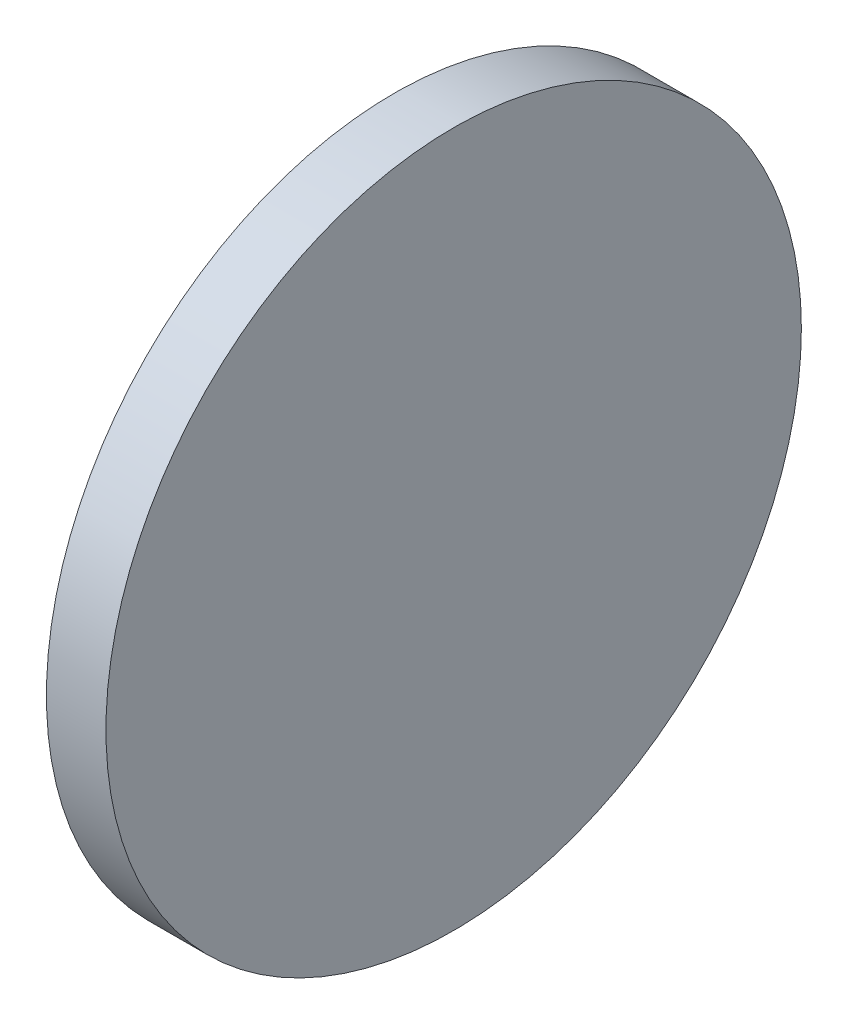
ISO-10303-21;
HEADER;
FILE_DESCRIPTION(('STEP AP214'),'2;1');
FILE_NAME('part.step','',(''),(''),'','','');
FILE_SCHEMA(('AUTOMOTIVE_DESIGN { 1 0 10303 214 1 1 1 1 }'));
ENDSEC;
DATA;
#1=APPLICATION_CONTEXT('core data for automotive mechanical design processes');
#2=APPLICATION_PROTOCOL_DEFINITION('international standard','automotive_design',2000,#1);
#3=PRODUCT_CONTEXT('',#1,'mechanical');
#4=PRODUCT('Part','Part','',(#3));
#5=PRODUCT_RELATED_PRODUCT_CATEGORY('part','',(#4));
#6=PRODUCT_DEFINITION_FORMATION('','',#4);
#7=PRODUCT_DEFINITION_CONTEXT('part definition',#1,'design');
#8=PRODUCT_DEFINITION('design','',#6,#7);
#9=PRODUCT_DEFINITION_SHAPE('','',#8);
#10=(LENGTH_UNIT() NAMED_UNIT(*) SI_UNIT(.MILLI.,.METRE.));
#11=(NAMED_UNIT(*) PLANE_ANGLE_UNIT() SI_UNIT($,.RADIAN.));
#12=(NAMED_UNIT(*) SI_UNIT($,.STERADIAN.) SOLID_ANGLE_UNIT());
#13=UNCERTAINTY_MEASURE_WITH_UNIT(LENGTH_MEASURE(1.E-05),#10,'distance_accuracy_value','');
#14=(GEOMETRIC_REPRESENTATION_CONTEXT(3) GLOBAL_UNCERTAINTY_ASSIGNED_CONTEXT((#13)) GLOBAL_UNIT_ASSIGNED_CONTEXT((#10,
#11,#12)) REPRESENTATION_CONTEXT('',''));
#15=CARTESIAN_POINT('',(0.,0.,0.));
#16=DIRECTION('',(0.,0.,1.));
#17=DIRECTION('',(1.,0.,0.));
#18=AXIS2_PLACEMENT_3D('',#15,#16,#17);
#19=CARTESIAN_POINT('',(-10.029852788347,0.,-1.62196645003831E-13));
#20=DIRECTION('',(0.999999999999989,0.,0.));
#21=DIRECTION('',(0.,0.,-1.));
#22=AXIS2_PLACEMENT_3D('',#19,#20,#21);
#23=PLANE('',#22);
#24=CARTESIAN_POINT('',(-10.029852788347,0.,-1.62196645003831E-13));
#25=DIRECTION('',(0.999999999999989,0.,0.));
#26=DIRECTION('',(0.,0.,-1.));
#27=AXIS2_PLACEMENT_3D('',#24,#25,#26);
#28=CIRCLE('',#27,10.);
#29=CARTESIAN_POINT('',(-10.029852788347,0.,-10.));
#30=VERTEX_POINT('',#29);
#31=EDGE_CURVE('E12',#30,#30,#28,.T.);
#32=ORIENTED_EDGE('',*,*,#31,.T.);
#33=EDGE_LOOP('',(#32));
#34=FACE_BOUND('',#33,.T.);
#35=ADVANCED_FACE('F49',(#34),#23,.T.);
#36=CARTESIAN_POINT('',(0.,0.,0.));
#37=DIRECTION('',(0.999999999999989,0.,0.));
#38=DIRECTION('',(0.,0.,-1.));
#39=AXIS2_PLACEMENT_3D('',#36,#37,#38);
#40=CYLINDRICAL_SURFACE('',#39,10.);
#41=CARTESIAN_POINT('',(-11.7421679655544,0.,0.));
#42=DIRECTION('',(0.999999999999989,0.,0.));
#43=DIRECTION('',(0.,0.,-1.));
#44=AXIS2_PLACEMENT_3D('',#41,#42,#43);
#45=CIRCLE('',#44,10.);
#46=CARTESIAN_POINT('',(-11.7421679655544,0.,-10.));
#47=VERTEX_POINT('',#46);
#48=EDGE_CURVE('E55',#47,#47,#45,.T.);
#49=CARTESIAN_POINT('',(-11.7421679655544,0.,-10.));
#50=CARTESIAN_POINT('',(-11.7243313491252,0.,-10.));
#51=CARTESIAN_POINT('',(-11.7064947326959,0.,-10.));
#52=CARTESIAN_POINT('',(-11.6708214998374,0.,-10.));
#53=CARTESIAN_POINT('',(-11.6529848834082,0.,-10.));
#54=CARTESIAN_POINT('',(-11.6173116505497,0.,-10.));
#55=CARTESIAN_POINT('',(-11.5994750341205,0.,-10.));
#56=CARTESIAN_POINT('',(-11.563801801262,0.,-10.));
#57=CARTESIAN_POINT('',(-11.5459651848327,0.,-10.));
#58=CARTESIAN_POINT('',(-11.5102919519742,0.,-10.));
#59=CARTESIAN_POINT('',(-11.492455335545,0.,-10.));
#60=CARTESIAN_POINT('',(-11.4567821026865,0.,-10.));
#61=CARTESIAN_POINT('',(-11.4389454862573,0.,-10.));
#62=CARTESIAN_POINT('',(-11.4032722533988,0.,-10.));
#63=CARTESIAN_POINT('',(-11.3854356369695,0.,-10.));
#64=CARTESIAN_POINT('',(-11.3497624041111,0.,-10.));
#65=CARTESIAN_POINT('',(-11.3319257876818,0.,-10.));
#66=CARTESIAN_POINT('',(-11.2962525548233,0.,-10.));
#67=CARTESIAN_POINT('',(-11.2784159383941,0.,-10.));
#68=CARTESIAN_POINT('',(-11.2427427055356,0.,-10.));
#69=CARTESIAN_POINT('',(-11.2249060891063,0.,-10.));
#70=CARTESIAN_POINT('',(-11.1892328562479,0.,-10.));
#71=CARTESIAN_POINT('',(-11.1713962398186,0.,-10.));
#72=CARTESIAN_POINT('',(-11.1357230069601,0.,-10.));
#73=CARTESIAN_POINT('',(-11.1178863905309,0.,-10.));
#74=CARTESIAN_POINT('',(-11.0822131576724,0.,-10.));
#75=CARTESIAN_POINT('',(-11.0643765412432,0.,-10.));
#76=CARTESIAN_POINT('',(-11.0287033083847,0.,-10.));
#77=CARTESIAN_POINT('',(-11.0108666919554,0.,-10.));
#78=CARTESIAN_POINT('',(-10.9751934590969,0.,-10.));
#79=CARTESIAN_POINT('',(-10.9573568426677,0.,-10.));
#80=CARTESIAN_POINT('',(-10.9216836098092,0.,-10.));
#81=CARTESIAN_POINT('',(-10.90384699338,0.,-10.));
#82=CARTESIAN_POINT('',(-10.8681737605215,0.,-10.));
#83=CARTESIAN_POINT('',(-10.8503371440922,0.,-10.));
#84=CARTESIAN_POINT('',(-10.8146639112337,0.,-10.));
#85=CARTESIAN_POINT('',(-10.7968272948045,0.,-10.));
#86=CARTESIAN_POINT('',(-10.761154061946,0.,-10.));
#87=CARTESIAN_POINT('',(-10.7433174455168,0.,-10.));
#88=CARTESIAN_POINT('',(-10.7076442126583,0.,-10.));
#89=CARTESIAN_POINT('',(-10.689807596229,0.,-10.));
#90=CARTESIAN_POINT('',(-10.6541343633705,0.,-10.));
#91=CARTESIAN_POINT('',(-10.6362977469413,0.,-10.));
#92=CARTESIAN_POINT('',(-10.6006245140828,0.,-10.));
#93=CARTESIAN_POINT('',(-10.5827878976536,0.,-10.));
#94=CARTESIAN_POINT('',(-10.5471146647951,0.,-10.));
#95=CARTESIAN_POINT('',(-10.5292780483658,0.,-10.));
#96=CARTESIAN_POINT('',(-10.4936048155074,0.,-10.));
#97=CARTESIAN_POINT('',(-10.4757681990781,0.,-10.));
#98=CARTESIAN_POINT('',(-10.4400949662196,0.,-10.));
#99=CARTESIAN_POINT('',(-10.4222583497904,0.,-10.));
#100=CARTESIAN_POINT('',(-10.3865851169319,0.,-10.));
#101=CARTESIAN_POINT('',(-10.3687485005026,0.,-10.));
#102=CARTESIAN_POINT('',(-10.3330752676442,0.,-10.));
#103=CARTESIAN_POINT('',(-10.3152386512149,0.,-10.));
#104=CARTESIAN_POINT('',(-10.2795654183564,0.,-10.));
#105=CARTESIAN_POINT('',(-10.2617288019272,0.,-10.));
#106=CARTESIAN_POINT('',(-10.2260555690687,0.,-10.));
#107=CARTESIAN_POINT('',(-10.2082189526395,0.,-10.));
#108=CARTESIAN_POINT('',(-10.172545719781,0.,-10.));
#109=CARTESIAN_POINT('',(-10.1547091033517,0.,-10.));
#110=CARTESIAN_POINT('',(-10.1190358704932,0.,-10.));
#111=CARTESIAN_POINT('',(-10.101199254064,0.,-10.));
#112=CARTESIAN_POINT('',(-10.0655260212055,0.,-10.));
#113=CARTESIAN_POINT('',(-10.0476894047763,0.,-10.));
#114=CARTESIAN_POINT('',(-10.029852788347,0.,-10.));
#115=B_SPLINE_CURVE_WITH_KNOTS('',3,(#49,#50,#51,#52,#53,#54,#55,#56,#57,#58,#59,#60,#61,#62,
#63,#64,#65,#66,#67,#68,#69,#70,#71,#72,#73,#74,#75,#76,#77,#78,#79,#80,#81,#82,#83,#84,#85,#86,
#87,#88,#89,#90,#91,#92,#93,#94,#95,#96,#97,#98,#99,#100,#101,#102,#103,#104,#105,#106,#107,
#108,#109,#110,#111,#112,#113,#114),.UNSPECIFIED.,.F.,.F.,(4,2,2,2,2,2,2,2,2,2,2,2,2,2,2,2,2,2,
2,2,2,2,2,2,2,2,2,2,2,2,2,2,4),(0.,0.0535098492877306,0.107019698575461,0.160529547863194,
0.214039397150922,0.267549246438655,0.321059095726387,0.374568945014116,0.428078794301848,
0.481588643589581,0.53509849287731,0.588608342165042,0.642118191452774,0.695628040740503,
0.749137890028235,0.802647739315966,0.856157588603697,0.909667437891429,0.96317728717916,
1.01668713646689,1.07019698575462,1.12370683504235,1.17721668433008,1.23072653361781,
1.28423638290555,1.33774623219328,1.39125608148101,1.44476593076874,1.49827578005647,
1.5517856293442,1.60529547863193,1.65880532791966,1.7123151772074),.UNSPECIFIED.);
#116=EDGE_CURVE('BSEAM61',#47,#30,#115,.T.);
#117=ORIENTED_EDGE('',*,*,#48,.T.);
#118=ORIENTED_EDGE('',*,*,#31,.F.);
#119=ORIENTED_EDGE('',*,*,#116,.T.);
#120=ORIENTED_EDGE('',*,*,#116,.F.);
#121=EDGE_LOOP('',(#117,#119,#118,#120));
#122=FACE_BOUND('',#121,.T.);
#123=ADVANCED_FACE('F61',(#122),#40,.T.);
#124=CARTESIAN_POINT('',(8.97014721165298,0.,-1.93421667571414E-13));
#125=DIRECTION('',(0.999999999999989,0.,0.));
#126=DIRECTION('',(0.,0.,-1.));
#127=AXIS2_PLACEMENT_3D('',#124,#125,#126);
#128=SPHERICAL_SURFACE('',#127,23.);
#129=ORIENTED_EDGE('',*,*,#48,.F.);
#130=EDGE_LOOP('',(#129));
#131=FACE_BOUND('',#130,.T.);
#132=ADVANCED_FACE('F64',(#131),#128,.T.);
#133=CLOSED_SHELL('',(#35,#123,#132));
#134=MANIFOLD_SOLID_BREP('B2',#133);
#135=ADVANCED_BREP_SHAPE_REPRESENTATION('',(#18,#134),#14);
#136=SHAPE_DEFINITION_REPRESENTATION(#9,#135);
ENDSEC;
END-ISO-10303-21;
